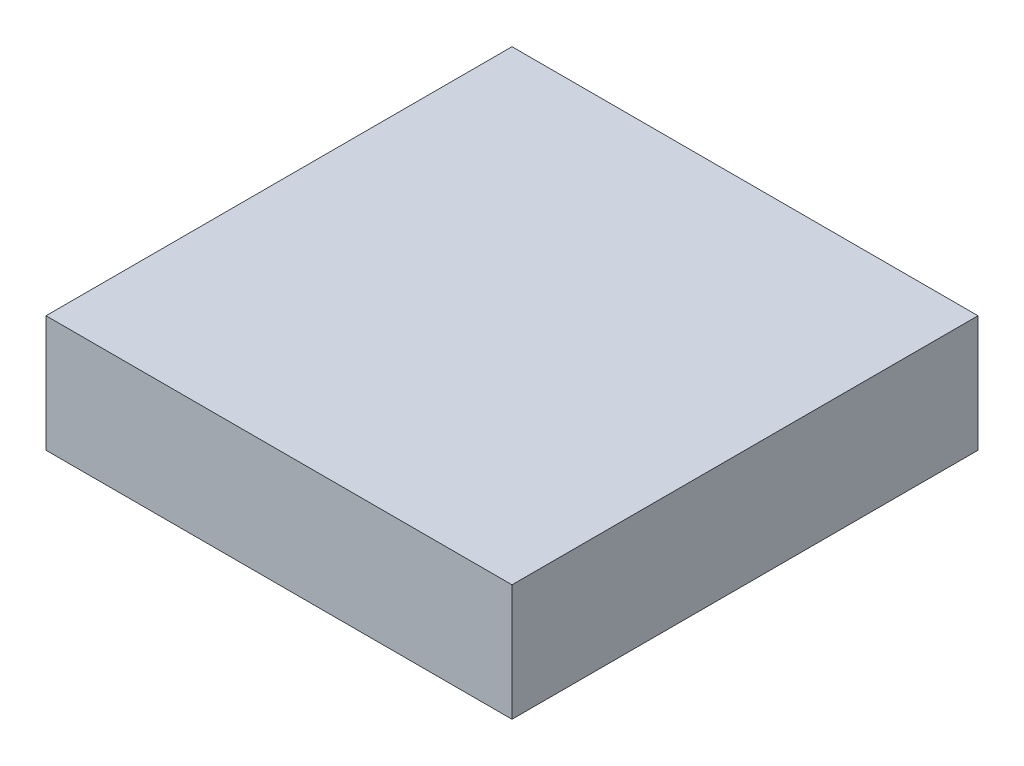
ISO-10303-21;
HEADER;
FILE_DESCRIPTION(('STEP AP214'),'2;1');
FILE_NAME('part.step','',(''),(''),'','','');
FILE_SCHEMA(('AUTOMOTIVE_DESIGN { 1 0 10303 214 1 1 1 1 }'));
ENDSEC;
DATA;
#1=APPLICATION_CONTEXT('core data for automotive mechanical design processes');
#2=APPLICATION_PROTOCOL_DEFINITION('international standard','automotive_design',2000,#1);
#3=PRODUCT_CONTEXT('',#1,'mechanical');
#4=PRODUCT('Part','Part','',(#3));
#5=PRODUCT_RELATED_PRODUCT_CATEGORY('part','',(#4));
#6=PRODUCT_DEFINITION_FORMATION('','',#4);
#7=PRODUCT_DEFINITION_CONTEXT('part definition',#1,'design');
#8=PRODUCT_DEFINITION('design','',#6,#7);
#9=PRODUCT_DEFINITION_SHAPE('','',#8);
#10=(LENGTH_UNIT() NAMED_UNIT(*) SI_UNIT(.MILLI.,.METRE.));
#11=(NAMED_UNIT(*) PLANE_ANGLE_UNIT() SI_UNIT($,.RADIAN.));
#12=(NAMED_UNIT(*) SI_UNIT($,.STERADIAN.) SOLID_ANGLE_UNIT());
#13=UNCERTAINTY_MEASURE_WITH_UNIT(LENGTH_MEASURE(1.E-05),#10,'distance_accuracy_value','');
#14=(GEOMETRIC_REPRESENTATION_CONTEXT(3) GLOBAL_UNCERTAINTY_ASSIGNED_CONTEXT((#13)) GLOBAL_UNIT_ASSIGNED_CONTEXT((#10,
#11,#12)) REPRESENTATION_CONTEXT('',''));
#15=CARTESIAN_POINT('',(0.,0.,0.));
#16=DIRECTION('',(0.,0.,1.));
#17=DIRECTION('',(1.,0.,0.));
#18=AXIS2_PLACEMENT_3D('',#15,#16,#17);
#19=CARTESIAN_POINT('',(12.,6.,12.));
#20=DIRECTION('',(-1.,0.,0.));
#21=DIRECTION('',(0.,0.,1.));
#22=AXIS2_PLACEMENT_3D('',#19,#20,#21);
#23=PLANE('',#22);
#24=DIRECTION('',(0.,0.,-1.));
#25=VECTOR('',#24,1.);
#26=CARTESIAN_POINT('',(12.,0.,12.));
#27=LINE('',#26,#25);
#28=CARTESIAN_POINT('',(12.,0.,12.));
#29=VERTEX_POINT('',#28);
#30=CARTESIAN_POINT('',(12.,0.,-12.));
#31=VERTEX_POINT('',#30);
#32=EDGE_CURVE('E100',#29,#31,#27,.T.);
#33=ORIENTED_EDGE('',*,*,#32,.T.);
#34=DIRECTION('',(0.,-1.,0.));
#35=VECTOR('',#34,1.);
#36=CARTESIAN_POINT('',(12.,6.,-12.));
#37=LINE('',#36,#35);
#38=CARTESIAN_POINT('',(12.,6.,-12.));
#39=VERTEX_POINT('',#38);
#40=EDGE_CURVE('E11',#39,#31,#37,.T.);
#41=ORIENTED_EDGE('',*,*,#40,.F.);
#42=DIRECTION('',(0.,0.,-1.));
#43=VECTOR('',#42,1.);
#44=CARTESIAN_POINT('',(12.,6.,12.));
#45=LINE('',#44,#43);
#46=CARTESIAN_POINT('',(12.,6.,12.));
#47=VERTEX_POINT('',#46);
#48=EDGE_CURVE('E88',#47,#39,#45,.T.);
#49=ORIENTED_EDGE('',*,*,#48,.F.);
#50=DIRECTION('',(0.,-1.,0.));
#51=VECTOR('',#50,1.);
#52=CARTESIAN_POINT('',(12.,6.,12.));
#53=LINE('',#52,#51);
#54=EDGE_CURVE('E96',#47,#29,#53,.T.);
#55=ORIENTED_EDGE('',*,*,#54,.T.);
#56=EDGE_LOOP('',(#33,#41,#49,#55));
#57=FACE_BOUND('',#56,.T.);
#58=ADVANCED_FACE('F37',(#57),#23,.F.);
#59=CARTESIAN_POINT('',(-12.,6.,-12.));
#60=DIRECTION('',(0.,0.,1.));
#61=DIRECTION('',(1.,0.,0.));
#62=AXIS2_PLACEMENT_3D('',#59,#60,#61);
#63=PLANE('',#62);
#64=DIRECTION('',(-1.,0.,0.));
#65=VECTOR('',#64,1.);
#66=CARTESIAN_POINT('',(-12.,0.,-12.));
#67=LINE('',#66,#65);
#68=CARTESIAN_POINT('',(-12.,0.,-12.));
#69=VERTEX_POINT('',#68);
#70=EDGE_CURVE('E92',#31,#69,#67,.T.);
#71=ORIENTED_EDGE('',*,*,#70,.T.);
#72=DIRECTION('',(0.,-1.,0.));
#73=VECTOR('',#72,1.);
#74=CARTESIAN_POINT('',(-12.,6.,-12.));
#75=LINE('',#74,#73);
#76=CARTESIAN_POINT('',(-12.,6.,-12.));
#77=VERTEX_POINT('',#76);
#78=EDGE_CURVE('E45',#77,#69,#75,.T.);
#79=ORIENTED_EDGE('',*,*,#78,.F.);
#80=DIRECTION('',(-1.,0.,0.));
#81=VECTOR('',#80,1.);
#82=CARTESIAN_POINT('',(-12.,6.,-12.));
#83=LINE('',#82,#81);
#84=EDGE_CURVE('E83',#39,#77,#83,.T.);
#85=ORIENTED_EDGE('',*,*,#84,.F.);
#86=ORIENTED_EDGE('',*,*,#40,.T.);
#87=EDGE_LOOP('',(#71,#79,#85,#86));
#88=FACE_BOUND('',#87,.T.);
#89=ADVANCED_FACE('F91',(#88),#63,.F.);
#90=CARTESIAN_POINT('',(-12.,6.,12.));
#91=DIRECTION('',(1.,0.,0.));
#92=DIRECTION('',(0.,0.,-1.));
#93=AXIS2_PLACEMENT_3D('',#90,#91,#92);
#94=PLANE('',#93);
#95=DIRECTION('',(0.,0.,1.));
#96=VECTOR('',#95,1.);
#97=CARTESIAN_POINT('',(-12.,0.,12.));
#98=LINE('',#97,#96);
#99=CARTESIAN_POINT('',(-12.,0.,12.));
#100=VERTEX_POINT('',#99);
#101=EDGE_CURVE('E70',#69,#100,#98,.T.);
#102=ORIENTED_EDGE('',*,*,#101,.T.);
#103=DIRECTION('',(0.,-1.,0.));
#104=VECTOR('',#103,1.);
#105=CARTESIAN_POINT('',(-12.,6.,12.));
#106=LINE('',#105,#104);
#107=CARTESIAN_POINT('',(-12.,6.,12.));
#108=VERTEX_POINT('',#107);
#109=EDGE_CURVE('E93',#108,#100,#106,.T.);
#110=ORIENTED_EDGE('',*,*,#109,.F.);
#111=DIRECTION('',(0.,0.,1.));
#112=VECTOR('',#111,1.);
#113=CARTESIAN_POINT('',(-12.,6.,12.));
#114=LINE('',#113,#112);
#115=EDGE_CURVE('E86',#77,#108,#114,.T.);
#116=ORIENTED_EDGE('',*,*,#115,.F.);
#117=ORIENTED_EDGE('',*,*,#78,.T.);
#118=EDGE_LOOP('',(#102,#110,#116,#117));
#119=FACE_BOUND('',#118,.T.);
#120=ADVANCED_FACE('F94',(#119),#94,.F.);
#121=CARTESIAN_POINT('',(-12.,6.,12.));
#122=DIRECTION('',(0.,0.,-1.));
#123=DIRECTION('',(-1.,0.,0.));
#124=AXIS2_PLACEMENT_3D('',#121,#122,#123);
#125=PLANE('',#124);
#126=DIRECTION('',(1.,0.,0.));
#127=VECTOR('',#126,1.);
#128=CARTESIAN_POINT('',(-12.,0.,12.));
#129=LINE('',#128,#127);
#130=EDGE_CURVE('E76',#100,#29,#129,.T.);
#131=ORIENTED_EDGE('',*,*,#130,.T.);
#132=ORIENTED_EDGE('',*,*,#54,.F.);
#133=DIRECTION('',(1.,0.,0.));
#134=VECTOR('',#133,1.);
#135=CARTESIAN_POINT('',(-12.,6.,12.));
#136=LINE('',#135,#134);
#137=EDGE_CURVE('E53',#108,#47,#136,.T.);
#138=ORIENTED_EDGE('',*,*,#137,.F.);
#139=ORIENTED_EDGE('',*,*,#109,.T.);
#140=EDGE_LOOP('',(#131,#132,#138,#139));
#141=FACE_BOUND('',#140,.T.);
#142=ADVANCED_FACE('F107',(#141),#125,.F.);
#143=CARTESIAN_POINT('',(0.,6.,0.));
#144=DIRECTION('',(0.,-1.,0.));
#145=DIRECTION('',(0.,0.,-1.));
#146=AXIS2_PLACEMENT_3D('',#143,#144,#145);
#147=PLANE('',#146);
#148=ORIENTED_EDGE('',*,*,#48,.T.);
#149=ORIENTED_EDGE('',*,*,#84,.T.);
#150=ORIENTED_EDGE('',*,*,#115,.T.);
#151=ORIENTED_EDGE('',*,*,#137,.T.);
#152=EDGE_LOOP('',(#148,#149,#150,#151));
#153=FACE_BOUND('',#152,.T.);
#154=ADVANCED_FACE('F84',(#153),#147,.F.);
#155=CARTESIAN_POINT('',(0.,0.,0.));
#156=DIRECTION('',(0.,-1.,0.));
#157=DIRECTION('',(0.,0.,-1.));
#158=AXIS2_PLACEMENT_3D('',#155,#156,#157);
#159=PLANE('',#158);
#160=ORIENTED_EDGE('',*,*,#32,.F.);
#161=ORIENTED_EDGE('',*,*,#130,.F.);
#162=ORIENTED_EDGE('',*,*,#101,.F.);
#163=ORIENTED_EDGE('',*,*,#70,.F.);
#164=EDGE_LOOP('',(#160,#161,#162,#163));
#165=FACE_BOUND('',#164,.T.);
#166=ADVANCED_FACE('F110',(#165),#159,.T.);
#167=CLOSED_SHELL('',(#58,#89,#120,#142,#154,#166));
#168=MANIFOLD_SOLID_BREP('B2',#167);
#169=ADVANCED_BREP_SHAPE_REPRESENTATION('',(#18,#168),#14);
#170=SHAPE_DEFINITION_REPRESENTATION(#9,#169);
ENDSEC;
END-ISO-10303-21;
